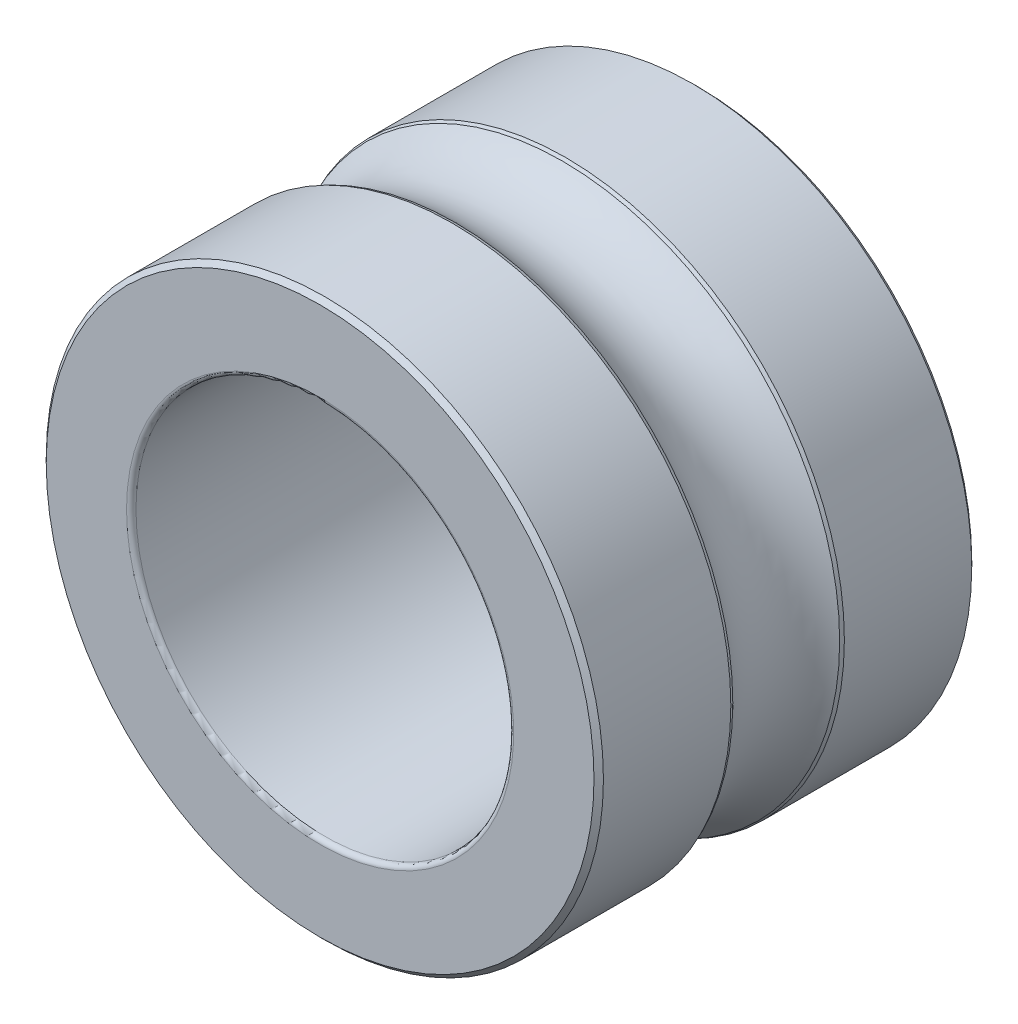
ISO-10303-21;
HEADER;
FILE_DESCRIPTION(('STEP AP214'),'2;1');
FILE_NAME('part.step','',(''),(''),'','','');
FILE_SCHEMA(('AUTOMOTIVE_DESIGN { 1 0 10303 214 1 1 1 1 }'));
ENDSEC;
DATA;
#1=APPLICATION_CONTEXT('core data for automotive mechanical design processes');
#2=APPLICATION_PROTOCOL_DEFINITION('international standard','automotive_design',2000,#1);
#3=PRODUCT_CONTEXT('',#1,'mechanical');
#4=PRODUCT('Part','Part','',(#3));
#5=PRODUCT_RELATED_PRODUCT_CATEGORY('part','',(#4));
#6=PRODUCT_DEFINITION_FORMATION('','',#4);
#7=PRODUCT_DEFINITION_CONTEXT('part definition',#1,'design');
#8=PRODUCT_DEFINITION('design','',#6,#7);
#9=PRODUCT_DEFINITION_SHAPE('','',#8);
#10=(LENGTH_UNIT() NAMED_UNIT(*) SI_UNIT(.MILLI.,.METRE.));
#11=(NAMED_UNIT(*) PLANE_ANGLE_UNIT() SI_UNIT($,.RADIAN.));
#12=(NAMED_UNIT(*) SI_UNIT($,.STERADIAN.) SOLID_ANGLE_UNIT());
#13=UNCERTAINTY_MEASURE_WITH_UNIT(LENGTH_MEASURE(1.E-05),#10,'distance_accuracy_value','');
#14=(GEOMETRIC_REPRESENTATION_CONTEXT(3) GLOBAL_UNCERTAINTY_ASSIGNED_CONTEXT((#13)) GLOBAL_UNIT_ASSIGNED_CONTEXT((#10,
#11,#12)) REPRESENTATION_CONTEXT('',''));
#15=CARTESIAN_POINT('',(0.,0.,0.));
#16=DIRECTION('',(0.,0.,1.));
#17=DIRECTION('',(1.,0.,0.));
#18=AXIS2_PLACEMENT_3D('',#15,#16,#17);
#19=CARTESIAN_POINT('',(0.,2.,2.));
#20=DIRECTION('',(0.,0.,-1.));
#21=DIRECTION('',(-1.,0.,0.));
#22=AXIS2_PLACEMENT_3D('',#19,#20,#21);
#23=PLANE('',#22);
#24=CARTESIAN_POINT('',(0.,0.,2.));
#25=DIRECTION('',(0.,0.,-1.));
#26=DIRECTION('',(-1.,0.,0.));
#27=AXIS2_PLACEMENT_3D('',#24,#25,#26);
#28=CIRCLE('',#27,2.05);
#29=CARTESIAN_POINT('',(-2.05,0.,2.));
#30=VERTEX_POINT('',#29);
#31=EDGE_CURVE('E48',#30,#30,#28,.T.);
#32=ORIENTED_EDGE('',*,*,#31,.T.);
#33=EDGE_LOOP('',(#32));
#34=FACE_BOUND('',#33,.T.);
#35=CARTESIAN_POINT('',(0.,0.,2.));
#36=DIRECTION('',(0.,0.,-1.));
#37=DIRECTION('',(-1.,0.,0.));
#38=AXIS2_PLACEMENT_3D('',#35,#36,#37);
#39=CIRCLE('',#38,2.9);
#40=CARTESIAN_POINT('',(-2.9,0.,2.));
#41=VERTEX_POINT('',#40);
#42=EDGE_CURVE('E61',#41,#41,#39,.F.);
#43=ORIENTED_EDGE('',*,*,#42,.T.);
#44=EDGE_LOOP('',(#43));
#45=FACE_BOUND('',#44,.T.);
#46=ADVANCED_FACE('F41',(#34,#45),#23,.F.);
#47=CARTESIAN_POINT('',(0.,0.,2.));
#48=DIRECTION('',(0.,0.,1.));
#49=DIRECTION('',(1.,0.,0.));
#50=AXIS2_PLACEMENT_3D('',#47,#48,#49);
#51=CYLINDRICAL_SURFACE('',#50,2.);
#52=CARTESIAN_POINT('',(0.,0.,1.95));
#53=DIRECTION('',(0.,0.,-1.));
#54=DIRECTION('',(-1.,0.,0.));
#55=AXIS2_PLACEMENT_3D('',#52,#53,#54);
#56=CIRCLE('',#55,2.);
#57=CARTESIAN_POINT('',(-2.,0.,1.95));
#58=VERTEX_POINT('',#57);
#59=EDGE_CURVE('E52',#58,#58,#56,.F.);
#60=ORIENTED_EDGE('',*,*,#59,.T.);
#61=EDGE_LOOP('',(#60));
#62=FACE_BOUND('',#61,.T.);
#63=CARTESIAN_POINT('',(0.,0.,-1.95));
#64=DIRECTION('',(0.,0.,1.));
#65=DIRECTION('',(1.,0.,0.));
#66=AXIS2_PLACEMENT_3D('',#63,#64,#65);
#67=CIRCLE('',#66,2.);
#68=CARTESIAN_POINT('',(2.,0.,-1.95));
#69=VERTEX_POINT('',#68);
#70=EDGE_CURVE('E56',#69,#69,#67,.F.);
#71=ORIENTED_EDGE('',*,*,#70,.T.);
#72=EDGE_LOOP('',(#71));
#73=FACE_BOUND('',#72,.T.);
#74=ADVANCED_FACE('F121',(#62,#73),#51,.F.);
#75=CARTESIAN_POINT('',(0.,2.,-2.));
#76=DIRECTION('',(0.,0.,1.));
#77=DIRECTION('',(1.,0.,0.));
#78=AXIS2_PLACEMENT_3D('',#75,#76,#77);
#79=PLANE('',#78);
#80=CARTESIAN_POINT('',(0.,0.,-2.));
#81=DIRECTION('',(0.,0.,1.));
#82=DIRECTION('',(1.,0.,0.));
#83=AXIS2_PLACEMENT_3D('',#80,#81,#82);
#84=CIRCLE('',#83,2.05);
#85=CARTESIAN_POINT('',(2.05,0.,-2.));
#86=VERTEX_POINT('',#85);
#87=EDGE_CURVE('E11',#86,#86,#84,.T.);
#88=ORIENTED_EDGE('',*,*,#87,.T.);
#89=EDGE_LOOP('',(#88));
#90=FACE_BOUND('',#89,.T.);
#91=CARTESIAN_POINT('',(0.,0.,-2.));
#92=DIRECTION('',(0.,0.,1.));
#93=DIRECTION('',(1.,0.,0.));
#94=AXIS2_PLACEMENT_3D('',#91,#92,#93);
#95=CIRCLE('',#94,2.9);
#96=CARTESIAN_POINT('',(2.9,0.,-2.));
#97=VERTEX_POINT('',#96);
#98=EDGE_CURVE('E76',#97,#97,#95,.F.);
#99=ORIENTED_EDGE('',*,*,#98,.T.);
#100=EDGE_LOOP('',(#99));
#101=FACE_BOUND('',#100,.T.);
#102=ADVANCED_FACE('F127',(#90,#101),#79,.F.);
#103=CARTESIAN_POINT('',(0.,0.,2.));
#104=DIRECTION('',(0.,0.,1.));
#105=DIRECTION('',(1.,0.,0.));
#106=AXIS2_PLACEMENT_3D('',#103,#104,#105);
#107=CYLINDRICAL_SURFACE('',#106,2.95);
#108=CARTESIAN_POINT('',(0.,0.,-1.95));
#109=DIRECTION('',(0.,0.,1.));
#110=DIRECTION('',(1.,0.,0.));
#111=AXIS2_PLACEMENT_3D('',#108,#109,#110);
#112=CIRCLE('',#111,2.95);
#113=CARTESIAN_POINT('',(2.95,0.,-1.95));
#114=VERTEX_POINT('',#113);
#115=EDGE_CURVE('E79',#114,#114,#112,.T.);
#116=ORIENTED_EDGE('',*,*,#115,.T.);
#117=EDGE_LOOP('',(#116));
#118=FACE_BOUND('',#117,.T.);
#119=CARTESIAN_POINT('',(0.,0.,-0.601100991535979));
#120=DIRECTION('',(0.,0.,-1.));
#121=DIRECTION('',(-1.,0.,0.));
#122=AXIS2_PLACEMENT_3D('',#119,#120,#121);
#123=CIRCLE('',#122,2.95);
#124=CARTESIAN_POINT('',(-2.95,0.,-0.601100991535979));
#125=VERTEX_POINT('',#124);
#126=EDGE_CURVE('E82',#125,#125,#123,.T.);
#127=ORIENTED_EDGE('',*,*,#126,.T.);
#128=EDGE_LOOP('',(#127));
#129=FACE_BOUND('',#128,.T.);
#130=ADVANCED_FACE('F86',(#118,#129),#107,.T.);
#131=CARTESIAN_POINT('',(0.,0.,0.));
#132=DIRECTION('',(0.,0.,1.));
#133=DIRECTION('',(1.,0.,0.));
#134=AXIS2_PLACEMENT_3D('',#131,#132,#133);
#135=TOROIDAL_SURFACE('',#134,3.5,0.799307012820179);
#136=CARTESIAN_POINT('',(0.,0.,-0.565713258804325));
#137=DIRECTION('',(0.,0.,1.));
#138=DIRECTION('',(1.,0.,0.));
#139=AXIS2_PLACEMENT_3D('',#136,#137,#138);
#140=CIRCLE('',#139,2.93532291567967);
#141=CARTESIAN_POINT('',(2.93532291567967,0.,-0.565713258804325));
#142=VERTEX_POINT('',#141);
#143=EDGE_CURVE('E70',#142,#142,#140,.T.);
#144=ORIENTED_EDGE('',*,*,#143,.T.);
#145=EDGE_LOOP('',(#144));
#146=FACE_BOUND('',#145,.T.);
#147=CARTESIAN_POINT('',(0.,0.,0.565713258804323));
#148=DIRECTION('',(0.,0.,-1.));
#149=DIRECTION('',(-1.,0.,0.));
#150=AXIS2_PLACEMENT_3D('',#147,#148,#149);
#151=CIRCLE('',#150,2.93532291567967);
#152=CARTESIAN_POINT('',(-2.93532291567967,0.,0.565713258804323));
#153=VERTEX_POINT('',#152);
#154=EDGE_CURVE('E73',#153,#153,#151,.T.);
#155=ORIENTED_EDGE('',*,*,#154,.T.);
#156=EDGE_LOOP('',(#155));
#157=FACE_BOUND('',#156,.T.);
#158=ADVANCED_FACE('F96',(#146,#157),#135,.F.);
#159=CARTESIAN_POINT('',(0.,0.,2.));
#160=DIRECTION('',(0.,0.,1.));
#161=DIRECTION('',(1.,0.,0.));
#162=AXIS2_PLACEMENT_3D('',#159,#160,#161);
#163=CYLINDRICAL_SURFACE('',#162,2.95);
#164=CARTESIAN_POINT('',(0.,0.,0.601100991535977));
#165=DIRECTION('',(0.,0.,1.));
#166=DIRECTION('',(1.,0.,0.));
#167=AXIS2_PLACEMENT_3D('',#164,#165,#166);
#168=CIRCLE('',#167,2.95);
#169=CARTESIAN_POINT('',(2.95,0.,0.601100991535977));
#170=VERTEX_POINT('',#169);
#171=EDGE_CURVE('E64',#170,#170,#168,.T.);
#172=ORIENTED_EDGE('',*,*,#171,.T.);
#173=EDGE_LOOP('',(#172));
#174=FACE_BOUND('',#173,.T.);
#175=CARTESIAN_POINT('',(0.,0.,1.95));
#176=DIRECTION('',(0.,0.,-1.));
#177=DIRECTION('',(-1.,0.,0.));
#178=AXIS2_PLACEMENT_3D('',#175,#176,#177);
#179=CIRCLE('',#178,2.95);
#180=CARTESIAN_POINT('',(-2.95,0.,1.95));
#181=VERTEX_POINT('',#180);
#182=EDGE_CURVE('E67',#181,#181,#179,.T.);
#183=ORIENTED_EDGE('',*,*,#182,.T.);
#184=EDGE_LOOP('',(#183));
#185=FACE_BOUND('',#184,.T.);
#186=ADVANCED_FACE('F99',(#174,#185),#163,.T.);
#187=CARTESIAN_POINT('',(0.,0.,-1.95));
#188=DIRECTION('',(0.,0.,1.));
#189=DIRECTION('',(1.,0.,0.));
#190=AXIS2_PLACEMENT_3D('',#187,#188,#189);
#191=CONICAL_SURFACE('',#190,2.95,0.785398163397453);
#192=ORIENTED_EDGE('',*,*,#98,.F.);
#193=EDGE_LOOP('',(#192));
#194=FACE_BOUND('',#193,.T.);
#195=ORIENTED_EDGE('',*,*,#115,.F.);
#196=EDGE_LOOP('',(#195));
#197=FACE_BOUND('',#196,.T.);
#198=ADVANCED_FACE('F92',(#194,#197),#191,.T.);
#199=CARTESIAN_POINT('',(0.,0.,-0.565713258804326));
#200=DIRECTION('',(0.,0.,-1.));
#201=DIRECTION('',(-1.,0.,0.));
#202=AXIS2_PLACEMENT_3D('',#199,#200,#201);
#203=CONICAL_SURFACE('',#202,2.93532291567967,0.393157407532845);
#204=ORIENTED_EDGE('',*,*,#126,.F.);
#205=EDGE_LOOP('',(#204));
#206=FACE_BOUND('',#205,.T.);
#207=ORIENTED_EDGE('',*,*,#143,.F.);
#208=EDGE_LOOP('',(#207));
#209=FACE_BOUND('',#208,.T.);
#210=ADVANCED_FACE('F88',(#206,#209),#203,.T.);
#211=CARTESIAN_POINT('',(0.,0.,0.601100991535977));
#212=DIRECTION('',(0.,0.,1.));
#213=DIRECTION('',(1.,0.,0.));
#214=AXIS2_PLACEMENT_3D('',#211,#212,#213);
#215=CONICAL_SURFACE('',#214,2.95,0.393157407532845);
#216=ORIENTED_EDGE('',*,*,#154,.F.);
#217=EDGE_LOOP('',(#216));
#218=FACE_BOUND('',#217,.T.);
#219=ORIENTED_EDGE('',*,*,#171,.F.);
#220=EDGE_LOOP('',(#219));
#221=FACE_BOUND('',#220,.T.);
#222=ADVANCED_FACE('F91',(#218,#221),#215,.T.);
#223=CARTESIAN_POINT('',(0.,0.,2.));
#224=DIRECTION('',(0.,0.,-1.));
#225=DIRECTION('',(-1.,0.,0.));
#226=AXIS2_PLACEMENT_3D('',#223,#224,#225);
#227=CONICAL_SURFACE('',#226,2.9,0.78539816339745);
#228=CARTESIAN_POINT('',(-2.95,0.,1.95));
#229=CARTESIAN_POINT('',(-2.94947916666667,0.,1.95052083333333));
#230=CARTESIAN_POINT('',(-2.94895833333333,0.,1.95104166666667));
#231=CARTESIAN_POINT('',(-2.94791666666667,0.,1.95208333333333));
#232=CARTESIAN_POINT('',(-2.94739583333333,0.,1.95260416666667));
#233=CARTESIAN_POINT('',(-2.94635416666667,0.,1.95364583333333));
#234=CARTESIAN_POINT('',(-2.94583333333333,0.,1.95416666666667));
#235=CARTESIAN_POINT('',(-2.94479166666667,0.,1.95520833333333));
#236=CARTESIAN_POINT('',(-2.94427083333333,0.,1.95572916666667));
#237=CARTESIAN_POINT('',(-2.94322916666667,0.,1.95677083333333));
#238=CARTESIAN_POINT('',(-2.94270833333333,0.,1.95729166666667));
#239=CARTESIAN_POINT('',(-2.94166666666667,0.,1.95833333333333));
#240=CARTESIAN_POINT('',(-2.94114583333333,0.,1.95885416666667));
#241=CARTESIAN_POINT('',(-2.94010416666667,0.,1.95989583333333));
#242=CARTESIAN_POINT('',(-2.93958333333333,0.,1.96041666666667));
#243=CARTESIAN_POINT('',(-2.93854166666667,0.,1.96145833333333));
#244=CARTESIAN_POINT('',(-2.93802083333333,0.,1.96197916666667));
#245=CARTESIAN_POINT('',(-2.93697916666667,0.,1.96302083333333));
#246=CARTESIAN_POINT('',(-2.93645833333333,0.,1.96354166666667));
#247=CARTESIAN_POINT('',(-2.93541666666667,0.,1.96458333333333));
#248=CARTESIAN_POINT('',(-2.93489583333333,0.,1.96510416666667));
#249=CARTESIAN_POINT('',(-2.93385416666667,0.,1.96614583333333));
#250=CARTESIAN_POINT('',(-2.93333333333333,0.,1.96666666666667));
#251=CARTESIAN_POINT('',(-2.93229166666667,0.,1.96770833333333));
#252=CARTESIAN_POINT('',(-2.93177083333333,0.,1.96822916666667));
#253=CARTESIAN_POINT('',(-2.93072916666667,0.,1.96927083333333));
#254=CARTESIAN_POINT('',(-2.93020833333333,0.,1.96979166666667));
#255=CARTESIAN_POINT('',(-2.92916666666667,0.,1.97083333333333));
#256=CARTESIAN_POINT('',(-2.92864583333333,0.,1.97135416666667));
#257=CARTESIAN_POINT('',(-2.92760416666667,0.,1.97239583333333));
#258=CARTESIAN_POINT('',(-2.92708333333333,0.,1.97291666666667));
#259=CARTESIAN_POINT('',(-2.92604166666667,0.,1.97395833333333));
#260=CARTESIAN_POINT('',(-2.92552083333333,0.,1.97447916666667));
#261=CARTESIAN_POINT('',(-2.92447916666667,0.,1.97552083333333));
#262=CARTESIAN_POINT('',(-2.92395833333333,0.,1.97604166666667));
#263=CARTESIAN_POINT('',(-2.92291666666667,0.,1.97708333333333));
#264=CARTESIAN_POINT('',(-2.92239583333333,0.,1.97760416666667));
#265=CARTESIAN_POINT('',(-2.92135416666667,0.,1.97864583333333));
#266=CARTESIAN_POINT('',(-2.92083333333333,0.,1.97916666666667));
#267=CARTESIAN_POINT('',(-2.91979166666667,0.,1.98020833333333));
#268=CARTESIAN_POINT('',(-2.91927083333333,0.,1.98072916666667));
#269=CARTESIAN_POINT('',(-2.91822916666667,0.,1.98177083333333));
#270=CARTESIAN_POINT('',(-2.91770833333333,0.,1.98229166666667));
#271=CARTESIAN_POINT('',(-2.91666666666667,0.,1.98333333333333));
#272=CARTESIAN_POINT('',(-2.91614583333333,0.,1.98385416666667));
#273=CARTESIAN_POINT('',(-2.91510416666667,0.,1.98489583333333));
#274=CARTESIAN_POINT('',(-2.91458333333333,0.,1.98541666666667));
#275=CARTESIAN_POINT('',(-2.91354166666667,0.,1.98645833333333));
#276=CARTESIAN_POINT('',(-2.91302083333333,0.,1.98697916666667));
#277=CARTESIAN_POINT('',(-2.91197916666667,0.,1.98802083333333));
#278=CARTESIAN_POINT('',(-2.91145833333333,0.,1.98854166666667));
#279=CARTESIAN_POINT('',(-2.91041666666667,0.,1.98958333333333));
#280=CARTESIAN_POINT('',(-2.90989583333333,0.,1.99010416666667));
#281=CARTESIAN_POINT('',(-2.90885416666667,0.,1.99114583333333));
#282=CARTESIAN_POINT('',(-2.90833333333333,0.,1.99166666666667));
#283=CARTESIAN_POINT('',(-2.90729166666667,0.,1.99270833333333));
#284=CARTESIAN_POINT('',(-2.90677083333333,0.,1.99322916666667));
#285=CARTESIAN_POINT('',(-2.90572916666667,0.,1.99427083333333));
#286=CARTESIAN_POINT('',(-2.90520833333333,0.,1.99479166666667));
#287=CARTESIAN_POINT('',(-2.90416666666667,0.,1.99583333333333));
#288=CARTESIAN_POINT('',(-2.90364583333333,0.,1.99635416666667));
#289=CARTESIAN_POINT('',(-2.90260416666667,0.,1.99739583333333));
#290=CARTESIAN_POINT('',(-2.90208333333333,0.,1.99791666666667));
#291=CARTESIAN_POINT('',(-2.90104166666667,0.,1.99895833333333));
#292=CARTESIAN_POINT('',(-2.90052083333333,0.,1.99947916666667));
#293=CARTESIAN_POINT('',(-2.9,0.,2.));
#294=B_SPLINE_CURVE_WITH_KNOTS('',3,(#228,#229,#230,#231,#232,#233,#234,#235,#236,#237,#238,
#239,#240,#241,#242,#243,#244,#245,#246,#247,#248,#249,#250,#251,#252,#253,#254,#255,#256,#257,
#258,#259,#260,#261,#262,#263,#264,#265,#266,#267,#268,#269,#270,#271,#272,#273,#274,#275,#276,
#277,#278,#279,#280,#281,#282,#283,#284,#285,#286,#287,#288,#289,#290,#291,#292,#293),
.UNSPECIFIED.,.F.,.F.,(4,2,2,2,2,2,2,2,2,2,2,2,2,2,2,2,2,2,2,2,2,2,2,2,2,2,2,2,2,2,2,2,4),(0.,
0.00220970869120818,0.0044194173824162,0.00662912607362392,0.00883883476483194,0.01104854345604,
0.013258252147248,0.015467960838456,0.017677669529664,0.0198873782208718,0.0220970869120798,
0.0243067956032878,0.0265165042944958,0.0287262129857039,0.0309359216769116,0.0331456303681196,
0.0353553390593276,0.0375650477505357,0.0397747564417437,0.0419844651329514,0.0441941738241597,
0.0464038825153675,0.0486135912065755,0.0508232998977835,0.0530330085889912,0.0552427172801995,
0.0574524259714073,0.0596621346626153,0.0618718433538233,0.064081552045031,0.0662912607362394,
0.0685009694274471,0.0707106781186551),.UNSPECIFIED.);
#295=EDGE_CURVE('BSEAM105',#181,#41,#294,.T.);
#296=ORIENTED_EDGE('',*,*,#182,.F.);
#297=ORIENTED_EDGE('',*,*,#42,.F.);
#298=ORIENTED_EDGE('',*,*,#295,.T.);
#299=ORIENTED_EDGE('',*,*,#295,.F.);
#300=EDGE_LOOP('',(#296,#298,#297,#299));
#301=FACE_BOUND('',#300,.T.);
#302=ADVANCED_FACE('F105',(#301),#227,.T.);
#303=CARTESIAN_POINT('',(0.,0.,1.95));
#304=DIRECTION('',(0.,0.,-1.));
#305=DIRECTION('',(-1.,0.,0.));
#306=AXIS2_PLACEMENT_3D('',#303,#304,#305);
#307=TOROIDAL_SURFACE('',#306,2.05,0.05);
#308=ORIENTED_EDGE('',*,*,#31,.F.);
#309=EDGE_LOOP('',(#308));
#310=FACE_BOUND('',#309,.T.);
#311=ORIENTED_EDGE('',*,*,#59,.F.);
#312=EDGE_LOOP('',(#311));
#313=FACE_BOUND('',#312,.T.);
#314=ADVANCED_FACE('F116',(#310,#313),#307,.T.);
#315=CARTESIAN_POINT('',(0.,0.,-1.95));
#316=DIRECTION('',(0.,0.,1.));
#317=DIRECTION('',(1.,0.,0.));
#318=AXIS2_PLACEMENT_3D('',#315,#316,#317);
#319=TOROIDAL_SURFACE('',#318,2.05,0.05);
#320=ORIENTED_EDGE('',*,*,#70,.F.);
#321=EDGE_LOOP('',(#320));
#322=FACE_BOUND('',#321,.T.);
#323=ORIENTED_EDGE('',*,*,#87,.F.);
#324=EDGE_LOOP('',(#323));
#325=FACE_BOUND('',#324,.T.);
#326=ADVANCED_FACE('F43',(#322,#325),#319,.T.);
#327=CLOSED_SHELL('',(#46,#74,#102,#130,#158,#186,#198,#210,#222,#302,#314,#326));
#328=MANIFOLD_SOLID_BREP('B2',#327);
#329=ADVANCED_BREP_SHAPE_REPRESENTATION('',(#18,#328),#14);
#330=SHAPE_DEFINITION_REPRESENTATION(#9,#329);
ENDSEC;
END-ISO-10303-21;
